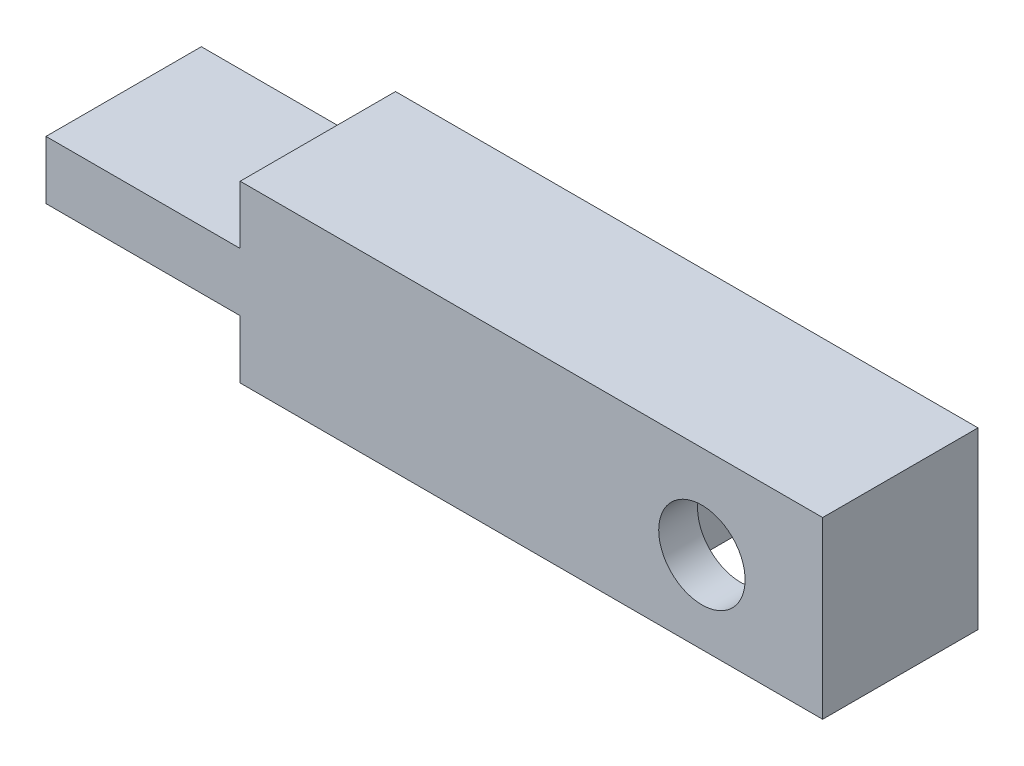
ISO-10303-21;
HEADER;
FILE_DESCRIPTION(('STEP AP214'),'2;1');
FILE_NAME('part.step','',(''),(''),'','','');
FILE_SCHEMA(('AUTOMOTIVE_DESIGN { 1 0 10303 214 1 1 1 1 }'));
ENDSEC;
DATA;
#1=APPLICATION_CONTEXT('core data for automotive mechanical design processes');
#2=APPLICATION_PROTOCOL_DEFINITION('international standard','automotive_design',2000,#1);
#3=PRODUCT_CONTEXT('',#1,'mechanical');
#4=PRODUCT('Part','Part','',(#3));
#5=PRODUCT_RELATED_PRODUCT_CATEGORY('part','',(#4));
#6=PRODUCT_DEFINITION_FORMATION('','',#4);
#7=PRODUCT_DEFINITION_CONTEXT('part definition',#1,'design');
#8=PRODUCT_DEFINITION('design','',#6,#7);
#9=PRODUCT_DEFINITION_SHAPE('','',#8);
#10=(LENGTH_UNIT() NAMED_UNIT(*) SI_UNIT(.MILLI.,.METRE.));
#11=(NAMED_UNIT(*) PLANE_ANGLE_UNIT() SI_UNIT($,.RADIAN.));
#12=(NAMED_UNIT(*) SI_UNIT($,.STERADIAN.) SOLID_ANGLE_UNIT());
#13=UNCERTAINTY_MEASURE_WITH_UNIT(LENGTH_MEASURE(1.E-05),#10,'distance_accuracy_value','');
#14=(GEOMETRIC_REPRESENTATION_CONTEXT(3) GLOBAL_UNCERTAINTY_ASSIGNED_CONTEXT((#13)) GLOBAL_UNIT_ASSIGNED_CONTEXT((#10,
#11,#12)) REPRESENTATION_CONTEXT('',''));
#15=CARTESIAN_POINT('',(0.,0.,0.));
#16=DIRECTION('',(0.,0.,1.));
#17=DIRECTION('',(1.,0.,0.));
#18=AXIS2_PLACEMENT_3D('',#15,#16,#17);
#19=CARTESIAN_POINT('',(-175.,45.,-20.));
#20=DIRECTION('',(0.,0.,1.));
#21=DIRECTION('',(1.,0.,0.));
#22=AXIS2_PLACEMENT_3D('',#19,#20,#21);
#23=PLANE('',#22);
#24=DIRECTION('',(-1.,0.,0.));
#25=VECTOR('',#24,1.);
#26=CARTESIAN_POINT('',(-175.,0.,-20.));
#27=LINE('',#26,#25);
#28=CARTESIAN_POINT('',(122.8,0.,-20.));
#29=VERTEX_POINT('',#28);
#30=CARTESIAN_POINT('',(25.,0.,-20.));
#31=VERTEX_POINT('',#30);
#32=EDGE_CURVE('E260',#29,#31,#27,.T.);
#33=ORIENTED_EDGE('',*,*,#32,.T.);
#34=DIRECTION('',(0.,1.,0.));
#35=VECTOR('',#34,1.);
#36=CARTESIAN_POINT('',(25.,0.,-20.));
#37=LINE('',#36,#35);
#38=CARTESIAN_POINT('',(25.,15.,-20.));
#39=VERTEX_POINT('',#38);
#40=EDGE_CURVE('E155',#31,#39,#37,.T.);
#41=ORIENTED_EDGE('',*,*,#40,.T.);
#42=DIRECTION('',(-1.,0.,0.));
#43=VECTOR('',#42,1.);
#44=CARTESIAN_POINT('',(0.,15.,-20.));
#45=LINE('',#44,#43);
#46=CARTESIAN_POINT('',(-25.,15.,-20.));
#47=VERTEX_POINT('',#46);
#48=EDGE_CURVE('E171',#39,#47,#45,.T.);
#49=ORIENTED_EDGE('',*,*,#48,.T.);
#50=DIRECTION('',(0.,1.,0.));
#51=VECTOR('',#50,1.);
#52=CARTESIAN_POINT('',(-25.,0.,-20.));
#53=LINE('',#52,#51);
#54=CARTESIAN_POINT('',(-25.,30.,-20.));
#55=VERTEX_POINT('',#54);
#56=EDGE_CURVE('E147',#47,#55,#53,.T.);
#57=ORIENTED_EDGE('',*,*,#56,.T.);
#58=DIRECTION('',(1.,0.,0.));
#59=VECTOR('',#58,1.);
#60=CARTESIAN_POINT('',(0.,30.,-20.));
#61=LINE('',#60,#59);
#62=CARTESIAN_POINT('',(25.,30.,-20.));
#63=VERTEX_POINT('',#62);
#64=EDGE_CURVE('E141',#55,#63,#61,.T.);
#65=ORIENTED_EDGE('',*,*,#64,.T.);
#66=DIRECTION('',(0.,1.,0.));
#67=VECTOR('',#66,1.);
#68=CARTESIAN_POINT('',(25.,0.,-20.));
#69=LINE('',#68,#67);
#70=CARTESIAN_POINT('',(25.,45.,-20.));
#71=VERTEX_POINT('',#70);
#72=EDGE_CURVE('E150',#63,#71,#69,.T.);
#73=ORIENTED_EDGE('',*,*,#72,.T.);
#74=DIRECTION('',(-1.,0.,0.));
#75=VECTOR('',#74,1.);
#76=CARTESIAN_POINT('',(-175.,45.,-20.));
#77=LINE('',#76,#75);
#78=CARTESIAN_POINT('',(175.,45.,-20.));
#79=VERTEX_POINT('',#78);
#80=EDGE_CURVE('E250',#79,#71,#77,.T.);
#81=ORIENTED_EDGE('',*,*,#80,.F.);
#82=DIRECTION('',(0.,-1.,0.));
#83=VECTOR('',#82,1.);
#84=CARTESIAN_POINT('',(175.,45.,-20.));
#85=LINE('',#84,#83);
#86=CARTESIAN_POINT('',(175.,0.,-20.));
#87=VERTEX_POINT('',#86);
#88=EDGE_CURVE('E11',#79,#87,#85,.T.);
#89=ORIENTED_EDGE('',*,*,#88,.T.);
#90=CARTESIAN_POINT('',(165.,0.,-20.));
#91=VERTEX_POINT('',#90);
#92=EDGE_CURVE('E261',#87,#91,#27,.T.);
#93=ORIENTED_EDGE('',*,*,#92,.T.);
#94=DIRECTION('',(0.,-1.,0.));
#95=VECTOR('',#94,1.);
#96=CARTESIAN_POINT('',(165.,0.,-20.));
#97=LINE('',#96,#95);
#98=CARTESIAN_POINT('',(165.,42.2,-20.));
#99=VERTEX_POINT('',#98);
#100=EDGE_CURVE('E209',#99,#91,#97,.T.);
#101=ORIENTED_EDGE('',*,*,#100,.F.);
#102=DIRECTION('',(1.,0.,0.));
#103=VECTOR('',#102,1.);
#104=CARTESIAN_POINT('',(165.,42.2,-20.));
#105=LINE('',#104,#103);
#106=CARTESIAN_POINT('',(122.8,42.2,-20.));
#107=VERTEX_POINT('',#106);
#108=EDGE_CURVE('E213',#107,#99,#105,.T.);
#109=ORIENTED_EDGE('',*,*,#108,.F.);
#110=DIRECTION('',(0.,1.,0.));
#111=VECTOR('',#110,1.);
#112=CARTESIAN_POINT('',(122.8,0.,-20.));
#113=LINE('',#112,#111);
#114=EDGE_CURVE('E226',#29,#107,#113,.T.);
#115=ORIENTED_EDGE('',*,*,#114,.F.);
#116=EDGE_LOOP('',(#33,#41,#49,#57,#65,#73,#81,#89,#93,#101,#109,#115));
#117=FACE_BOUND('',#116,.T.);
#118=ADVANCED_FACE('F45',(#117),#23,.F.);
#119=CARTESIAN_POINT('',(0.,0.,0.));
#120=DIRECTION('',(0.,-1.,0.));
#121=DIRECTION('',(0.,0.,-1.));
#122=AXIS2_PLACEMENT_3D('',#119,#120,#121);
#123=PLANE('',#122);
#124=DIRECTION('',(0.,0.,1.));
#125=VECTOR('',#124,1.);
#126=CARTESIAN_POINT('',(25.,0.,-20.));
#127=LINE('',#126,#125);
#128=CARTESIAN_POINT('',(25.,0.,20.));
#129=VERTEX_POINT('',#128);
#130=EDGE_CURVE('E197',#31,#129,#127,.T.);
#131=ORIENTED_EDGE('',*,*,#130,.F.);
#132=ORIENTED_EDGE('',*,*,#32,.F.);
#133=DIRECTION('',(0.,0.,-1.));
#134=VECTOR('',#133,1.);
#135=CARTESIAN_POINT('',(122.8,0.,10.));
#136=LINE('',#135,#134);
#137=CARTESIAN_POINT('',(122.8,0.,10.));
#138=VERTEX_POINT('',#137);
#139=EDGE_CURVE('E240',#138,#29,#136,.T.);
#140=ORIENTED_EDGE('',*,*,#139,.F.);
#141=DIRECTION('',(-1.,0.,0.));
#142=VECTOR('',#141,1.);
#143=CARTESIAN_POINT('',(165.,0.,10.));
#144=LINE('',#143,#142);
#145=CARTESIAN_POINT('',(165.,0.,10.));
#146=VERTEX_POINT('',#145);
#147=EDGE_CURVE('E212',#146,#138,#144,.T.);
#148=ORIENTED_EDGE('',*,*,#147,.F.);
#149=DIRECTION('',(0.,0.,-1.));
#150=VECTOR('',#149,1.);
#151=CARTESIAN_POINT('',(165.,0.,10.));
#152=LINE('',#151,#150);
#153=EDGE_CURVE('E223',#146,#91,#152,.T.);
#154=ORIENTED_EDGE('',*,*,#153,.T.);
#155=ORIENTED_EDGE('',*,*,#92,.F.);
#156=DIRECTION('',(0.,0.,-1.));
#157=VECTOR('',#156,1.);
#158=CARTESIAN_POINT('',(175.,0.,20.));
#159=LINE('',#158,#157);
#160=CARTESIAN_POINT('',(175.,0.,20.));
#161=VERTEX_POINT('',#160);
#162=EDGE_CURVE('E236',#161,#87,#159,.T.);
#163=ORIENTED_EDGE('',*,*,#162,.F.);
#164=DIRECTION('',(1.,0.,0.));
#165=VECTOR('',#164,1.);
#166=CARTESIAN_POINT('',(-175.,0.,20.));
#167=LINE('',#166,#165);
#168=EDGE_CURVE('E251',#129,#161,#167,.T.);
#169=ORIENTED_EDGE('',*,*,#168,.F.);
#170=EDGE_LOOP('',(#131,#132,#140,#148,#154,#155,#163,#169));
#171=FACE_BOUND('',#170,.T.);
#172=ADVANCED_FACE('F278',(#171),#123,.T.);
#173=CARTESIAN_POINT('',(175.,45.,20.));
#174=DIRECTION('',(-1.,0.,0.));
#175=DIRECTION('',(0.,0.,1.));
#176=AXIS2_PLACEMENT_3D('',#173,#174,#175);
#177=PLANE('',#176);
#178=ORIENTED_EDGE('',*,*,#162,.T.);
#179=ORIENTED_EDGE('',*,*,#88,.F.);
#180=DIRECTION('',(0.,0.,-1.));
#181=VECTOR('',#180,1.);
#182=CARTESIAN_POINT('',(175.,45.,20.));
#183=LINE('',#182,#181);
#184=CARTESIAN_POINT('',(175.,45.,20.));
#185=VERTEX_POINT('',#184);
#186=EDGE_CURVE('E246',#185,#79,#183,.T.);
#187=ORIENTED_EDGE('',*,*,#186,.F.);
#188=DIRECTION('',(0.,-1.,0.));
#189=VECTOR('',#188,1.);
#190=CARTESIAN_POINT('',(175.,45.,20.));
#191=LINE('',#190,#189);
#192=EDGE_CURVE('E54',#185,#161,#191,.T.);
#193=ORIENTED_EDGE('',*,*,#192,.T.);
#194=EDGE_LOOP('',(#178,#179,#187,#193));
#195=FACE_BOUND('',#194,.T.);
#196=ADVANCED_FACE('F47',(#195),#177,.F.);
#197=CARTESIAN_POINT('',(-175.,45.,20.));
#198=DIRECTION('',(0.,0.,-1.));
#199=DIRECTION('',(-1.,0.,0.));
#200=AXIS2_PLACEMENT_3D('',#197,#198,#199);
#201=PLANE('',#200);
#202=CARTESIAN_POINT('',(143.9,21.1,20.));
#203=DIRECTION('',(0.,0.,-1.));
#204=DIRECTION('',(-1.,0.,0.));
#205=AXIS2_PLACEMENT_3D('',#202,#203,#204);
#206=CIRCLE('',#205,11.125);
#207=CARTESIAN_POINT('',(132.775,21.1,20.));
#208=VERTEX_POINT('',#207);
#209=EDGE_CURVE('E205',#208,#208,#206,.T.);
#210=ORIENTED_EDGE('',*,*,#209,.T.);
#211=EDGE_LOOP('',(#210));
#212=FACE_BOUND('',#211,.T.);
#213=DIRECTION('',(-1.,0.,0.));
#214=VECTOR('',#213,1.);
#215=CARTESIAN_POINT('',(0.,15.,20.));
#216=LINE('',#215,#214);
#217=CARTESIAN_POINT('',(25.,15.,20.));
#218=VERTEX_POINT('',#217);
#219=CARTESIAN_POINT('',(-25.,15.,20.));
#220=VERTEX_POINT('',#219);
#221=EDGE_CURVE('E165',#218,#220,#216,.T.);
#222=ORIENTED_EDGE('',*,*,#221,.F.);
#223=DIRECTION('',(0.,1.,0.));
#224=VECTOR('',#223,1.);
#225=CARTESIAN_POINT('',(25.,0.,20.));
#226=LINE('',#225,#224);
#227=EDGE_CURVE('E180',#129,#218,#226,.T.);
#228=ORIENTED_EDGE('',*,*,#227,.F.);
#229=ORIENTED_EDGE('',*,*,#168,.T.);
#230=ORIENTED_EDGE('',*,*,#192,.F.);
#231=DIRECTION('',(1.,0.,0.));
#232=VECTOR('',#231,1.);
#233=CARTESIAN_POINT('',(-175.,45.,20.));
#234=LINE('',#233,#232);
#235=CARTESIAN_POINT('',(25.,45.,20.));
#236=VERTEX_POINT('',#235);
#237=EDGE_CURVE('E254',#236,#185,#234,.T.);
#238=ORIENTED_EDGE('',*,*,#237,.F.);
#239=DIRECTION('',(0.,1.,0.));
#240=VECTOR('',#239,1.);
#241=CARTESIAN_POINT('',(25.,0.,20.));
#242=LINE('',#241,#240);
#243=CARTESIAN_POINT('',(25.,30.,20.));
#244=VERTEX_POINT('',#243);
#245=EDGE_CURVE('E61',#244,#236,#242,.T.);
#246=ORIENTED_EDGE('',*,*,#245,.F.);
#247=DIRECTION('',(1.,0.,0.));
#248=VECTOR('',#247,1.);
#249=CARTESIAN_POINT('',(0.,30.,20.));
#250=LINE('',#249,#248);
#251=CARTESIAN_POINT('',(-25.,30.,20.));
#252=VERTEX_POINT('',#251);
#253=EDGE_CURVE('E144',#252,#244,#250,.T.);
#254=ORIENTED_EDGE('',*,*,#253,.F.);
#255=DIRECTION('',(0.,1.,0.));
#256=VECTOR('',#255,1.);
#257=CARTESIAN_POINT('',(-25.,0.,20.));
#258=LINE('',#257,#256);
#259=EDGE_CURVE('E161',#220,#252,#258,.T.);
#260=ORIENTED_EDGE('',*,*,#259,.F.);
#261=EDGE_LOOP('',(#222,#228,#229,#230,#238,#246,#254,#260));
#262=FACE_BOUND('',#261,.T.);
#263=ADVANCED_FACE('F284',(#212,#262),#201,.F.);
#264=CARTESIAN_POINT('',(0.,45.,0.));
#265=DIRECTION('',(0.,-1.,0.));
#266=DIRECTION('',(0.,0.,-1.));
#267=AXIS2_PLACEMENT_3D('',#264,#265,#266);
#268=PLANE('',#267);
#269=ORIENTED_EDGE('',*,*,#80,.T.);
#270=DIRECTION('',(0.,0.,1.));
#271=VECTOR('',#270,1.);
#272=CARTESIAN_POINT('',(25.,45.,-20.));
#273=LINE('',#272,#271);
#274=EDGE_CURVE('E146',#71,#236,#273,.T.);
#275=ORIENTED_EDGE('',*,*,#274,.T.);
#276=ORIENTED_EDGE('',*,*,#237,.T.);
#277=ORIENTED_EDGE('',*,*,#186,.T.);
#278=EDGE_LOOP('',(#269,#275,#276,#277));
#279=FACE_BOUND('',#278,.T.);
#280=ADVANCED_FACE('F282',(#279),#268,.F.);
#281=CARTESIAN_POINT('',(165.,0.,10.));
#282=DIRECTION('',(1.,0.,0.));
#283=DIRECTION('',(0.,0.,-1.));
#284=AXIS2_PLACEMENT_3D('',#281,#282,#283);
#285=PLANE('',#284);
#286=ORIENTED_EDGE('',*,*,#100,.T.);
#287=ORIENTED_EDGE('',*,*,#153,.F.);
#288=DIRECTION('',(0.,-1.,0.));
#289=VECTOR('',#288,1.);
#290=CARTESIAN_POINT('',(165.,0.,10.));
#291=LINE('',#290,#289);
#292=CARTESIAN_POINT('',(165.,42.2,10.));
#293=VERTEX_POINT('',#292);
#294=EDGE_CURVE('E69',#293,#146,#291,.T.);
#295=ORIENTED_EDGE('',*,*,#294,.F.);
#296=DIRECTION('',(0.,0.,-1.));
#297=VECTOR('',#296,1.);
#298=CARTESIAN_POINT('',(165.,42.2,10.));
#299=LINE('',#298,#297);
#300=EDGE_CURVE('E233',#293,#99,#299,.T.);
#301=ORIENTED_EDGE('',*,*,#300,.T.);
#302=EDGE_LOOP('',(#286,#287,#295,#301));
#303=FACE_BOUND('',#302,.T.);
#304=ADVANCED_FACE('F306',(#303),#285,.F.);
#305=CARTESIAN_POINT('',(165.,42.2,10.));
#306=DIRECTION('',(0.,1.,0.));
#307=DIRECTION('',(0.,0.,1.));
#308=AXIS2_PLACEMENT_3D('',#305,#306,#307);
#309=PLANE('',#308);
#310=ORIENTED_EDGE('',*,*,#108,.T.);
#311=ORIENTED_EDGE('',*,*,#300,.F.);
#312=DIRECTION('',(1.,0.,0.));
#313=VECTOR('',#312,1.);
#314=CARTESIAN_POINT('',(165.,42.2,10.));
#315=LINE('',#314,#313);
#316=CARTESIAN_POINT('',(122.8,42.2,10.));
#317=VERTEX_POINT('',#316);
#318=EDGE_CURVE('E220',#317,#293,#315,.T.);
#319=ORIENTED_EDGE('',*,*,#318,.F.);
#320=DIRECTION('',(0.,0.,-1.));
#321=VECTOR('',#320,1.);
#322=CARTESIAN_POINT('',(122.8,42.2,10.));
#323=LINE('',#322,#321);
#324=EDGE_CURVE('E237',#317,#107,#323,.T.);
#325=ORIENTED_EDGE('',*,*,#324,.T.);
#326=EDGE_LOOP('',(#310,#311,#319,#325));
#327=FACE_BOUND('',#326,.T.);
#328=ADVANCED_FACE('F304',(#327),#309,.F.);
#329=CARTESIAN_POINT('',(122.8,0.,10.));
#330=DIRECTION('',(-1.,0.,0.));
#331=DIRECTION('',(0.,0.,1.));
#332=AXIS2_PLACEMENT_3D('',#329,#330,#331);
#333=PLANE('',#332);
#334=ORIENTED_EDGE('',*,*,#114,.T.);
#335=ORIENTED_EDGE('',*,*,#324,.F.);
#336=DIRECTION('',(0.,1.,0.));
#337=VECTOR('',#336,1.);
#338=CARTESIAN_POINT('',(122.8,0.,10.));
#339=LINE('',#338,#337);
#340=EDGE_CURVE('E216',#138,#317,#339,.T.);
#341=ORIENTED_EDGE('',*,*,#340,.F.);
#342=ORIENTED_EDGE('',*,*,#139,.T.);
#343=EDGE_LOOP('',(#334,#335,#341,#342));
#344=FACE_BOUND('',#343,.T.);
#345=ADVANCED_FACE('F300',(#344),#333,.F.);
#346=CARTESIAN_POINT('',(0.,0.,10.));
#347=DIRECTION('',(0.,0.,1.));
#348=DIRECTION('',(1.,0.,0.));
#349=AXIS2_PLACEMENT_3D('',#346,#347,#348);
#350=PLANE('',#349);
#351=CARTESIAN_POINT('',(143.9,21.1,10.));
#352=DIRECTION('',(0.,0.,-1.));
#353=DIRECTION('',(-1.,0.,0.));
#354=AXIS2_PLACEMENT_3D('',#351,#352,#353);
#355=CIRCLE('',#354,11.125);
#356=CARTESIAN_POINT('',(132.775,21.1,10.));
#357=VERTEX_POINT('',#356);
#358=EDGE_CURVE('E190',#357,#357,#355,.T.);
#359=ORIENTED_EDGE('',*,*,#358,.F.);
#360=EDGE_LOOP('',(#359));
#361=FACE_BOUND('',#360,.T.);
#362=ORIENTED_EDGE('',*,*,#294,.T.);
#363=ORIENTED_EDGE('',*,*,#147,.T.);
#364=ORIENTED_EDGE('',*,*,#340,.T.);
#365=ORIENTED_EDGE('',*,*,#318,.T.);
#366=EDGE_LOOP('',(#362,#363,#364,#365));
#367=FACE_BOUND('',#366,.T.);
#368=ADVANCED_FACE('F301',(#361,#367),#350,.F.);
#369=CARTESIAN_POINT('',(143.9,21.1,40.));
#370=DIRECTION('',(0.,0.,-1.));
#371=DIRECTION('',(-1.,0.,0.));
#372=AXIS2_PLACEMENT_3D('',#369,#370,#371);
#373=CYLINDRICAL_SURFACE('',#372,11.125);
#374=ORIENTED_EDGE('',*,*,#358,.T.);
#375=EDGE_LOOP('',(#374));
#376=FACE_BOUND('',#375,.T.);
#377=ORIENTED_EDGE('',*,*,#209,.F.);
#378=EDGE_LOOP('',(#377));
#379=FACE_BOUND('',#378,.T.);
#380=ADVANCED_FACE('F330',(#376,#379),#373,.F.);
#381=CARTESIAN_POINT('',(0.,30.,-20.));
#382=DIRECTION('',(0.,-1.,0.));
#383=DIRECTION('',(0.,0.,-1.));
#384=AXIS2_PLACEMENT_3D('',#381,#382,#383);
#385=PLANE('',#384);
#386=ORIENTED_EDGE('',*,*,#253,.T.);
#387=DIRECTION('',(0.,0.,1.));
#388=VECTOR('',#387,1.);
#389=CARTESIAN_POINT('',(25.,30.,-20.));
#390=LINE('',#389,#388);
#391=EDGE_CURVE('E137',#63,#244,#390,.T.);
#392=ORIENTED_EDGE('',*,*,#391,.F.);
#393=ORIENTED_EDGE('',*,*,#64,.F.);
#394=DIRECTION('',(0.,0.,1.));
#395=VECTOR('',#394,1.);
#396=CARTESIAN_POINT('',(-25.,30.,-20.));
#397=LINE('',#396,#395);
#398=EDGE_CURVE('E187',#55,#252,#397,.T.);
#399=ORIENTED_EDGE('',*,*,#398,.T.);
#400=EDGE_LOOP('',(#386,#392,#393,#399));
#401=FACE_BOUND('',#400,.T.);
#402=ADVANCED_FACE('F139',(#401),#385,.F.);
#403=CARTESIAN_POINT('',(-25.,0.,-20.));
#404=DIRECTION('',(1.,0.,0.));
#405=DIRECTION('',(0.,1.,0.));
#406=AXIS2_PLACEMENT_3D('',#403,#404,#405);
#407=PLANE('',#406);
#408=ORIENTED_EDGE('',*,*,#259,.T.);
#409=ORIENTED_EDGE('',*,*,#398,.F.);
#410=ORIENTED_EDGE('',*,*,#56,.F.);
#411=DIRECTION('',(0.,0.,1.));
#412=VECTOR('',#411,1.);
#413=CARTESIAN_POINT('',(-25.,15.,-20.));
#414=LINE('',#413,#412);
#415=EDGE_CURVE('E191',#47,#220,#414,.T.);
#416=ORIENTED_EDGE('',*,*,#415,.T.);
#417=EDGE_LOOP('',(#408,#409,#410,#416));
#418=FACE_BOUND('',#417,.T.);
#419=ADVANCED_FACE('F288',(#418),#407,.F.);
#420=CARTESIAN_POINT('',(0.,15.,-20.));
#421=DIRECTION('',(0.,1.,0.));
#422=DIRECTION('',(-1.,0.,0.));
#423=AXIS2_PLACEMENT_3D('',#420,#421,#422);
#424=PLANE('',#423);
#425=ORIENTED_EDGE('',*,*,#221,.T.);
#426=ORIENTED_EDGE('',*,*,#415,.F.);
#427=ORIENTED_EDGE('',*,*,#48,.F.);
#428=DIRECTION('',(0.,0.,1.));
#429=VECTOR('',#428,1.);
#430=CARTESIAN_POINT('',(25.,15.,-20.));
#431=LINE('',#430,#429);
#432=EDGE_CURVE('E194',#39,#218,#431,.T.);
#433=ORIENTED_EDGE('',*,*,#432,.T.);
#434=EDGE_LOOP('',(#425,#426,#427,#433));
#435=FACE_BOUND('',#434,.T.);
#436=ADVANCED_FACE('F291',(#435),#424,.F.);
#437=CARTESIAN_POINT('',(25.,0.,-20.));
#438=DIRECTION('',(1.,0.,0.));
#439=DIRECTION('',(0.,1.,0.));
#440=AXIS2_PLACEMENT_3D('',#437,#438,#439);
#441=PLANE('',#440);
#442=ORIENTED_EDGE('',*,*,#227,.T.);
#443=ORIENTED_EDGE('',*,*,#432,.F.);
#444=ORIENTED_EDGE('',*,*,#40,.F.);
#445=ORIENTED_EDGE('',*,*,#130,.T.);
#446=EDGE_LOOP('',(#442,#443,#444,#445));
#447=FACE_BOUND('',#446,.T.);
#448=ADVANCED_FACE('F293',(#447),#441,.F.);
#449=CARTESIAN_POINT('',(25.,0.,-20.));
#450=DIRECTION('',(1.,0.,0.));
#451=DIRECTION('',(0.,1.,0.));
#452=AXIS2_PLACEMENT_3D('',#449,#450,#451);
#453=PLANE('',#452);
#454=ORIENTED_EDGE('',*,*,#245,.T.);
#455=ORIENTED_EDGE('',*,*,#274,.F.);
#456=ORIENTED_EDGE('',*,*,#72,.F.);
#457=ORIENTED_EDGE('',*,*,#391,.T.);
#458=EDGE_LOOP('',(#454,#455,#456,#457));
#459=FACE_BOUND('',#458,.T.);
#460=ADVANCED_FACE('F151',(#459),#453,.F.);
#461=CLOSED_SHELL('',(#118,#172,#196,#263,#280,#304,#328,#345,#368,#380,#402,#419,#436,#448,#460));
#462=MANIFOLD_SOLID_BREP('B2',#461);
#463=ADVANCED_BREP_SHAPE_REPRESENTATION('',(#18,#462),#14);
#464=SHAPE_DEFINITION_REPRESENTATION(#9,#463);
ENDSEC;
END-ISO-10303-21;
